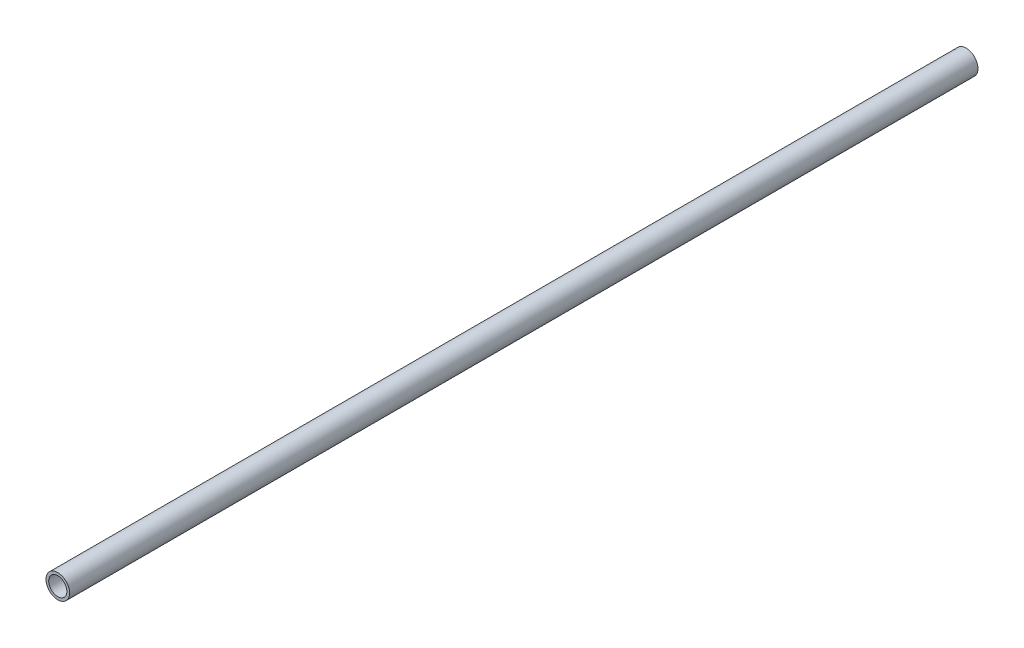
ISO-10303-21;
HEADER;
FILE_DESCRIPTION(('STEP AP214'),'2;1');
FILE_NAME('part.step','',(''),(''),'','','');
FILE_SCHEMA(('AUTOMOTIVE_DESIGN { 1 0 10303 214 1 1 1 1 }'));
ENDSEC;
DATA;
#1=APPLICATION_CONTEXT('core data for automotive mechanical design processes');
#2=APPLICATION_PROTOCOL_DEFINITION('international standard','automotive_design',2000,#1);
#3=PRODUCT_CONTEXT('',#1,'mechanical');
#4=PRODUCT('Part','Part','',(#3));
#5=PRODUCT_RELATED_PRODUCT_CATEGORY('part','',(#4));
#6=PRODUCT_DEFINITION_FORMATION('','',#4);
#7=PRODUCT_DEFINITION_CONTEXT('part definition',#1,'design');
#8=PRODUCT_DEFINITION('design','',#6,#7);
#9=PRODUCT_DEFINITION_SHAPE('','',#8);
#10=(LENGTH_UNIT() NAMED_UNIT(*) SI_UNIT(.MILLI.,.METRE.));
#11=(NAMED_UNIT(*) PLANE_ANGLE_UNIT() SI_UNIT($,.RADIAN.));
#12=(NAMED_UNIT(*) SI_UNIT($,.STERADIAN.) SOLID_ANGLE_UNIT());
#13=UNCERTAINTY_MEASURE_WITH_UNIT(LENGTH_MEASURE(1.E-05),#10,'distance_accuracy_value','');
#14=(GEOMETRIC_REPRESENTATION_CONTEXT(3) GLOBAL_UNCERTAINTY_ASSIGNED_CONTEXT((#13)) GLOBAL_UNIT_ASSIGNED_CONTEXT((#10,
#11,#12)) REPRESENTATION_CONTEXT('',''));
#15=CARTESIAN_POINT('',(0.,0.,0.));
#16=DIRECTION('',(0.,0.,1.));
#17=DIRECTION('',(1.,0.,0.));
#18=AXIS2_PLACEMENT_3D('',#15,#16,#17);
#19=CARTESIAN_POINT('',(390.761403900086,31.0815288811455,500.));
#20=DIRECTION('',(0.,0.,1.));
#21=DIRECTION('',(1.,0.,0.));
#22=AXIS2_PLACEMENT_3D('',#19,#20,#21);
#23=PLANE('',#22);
#24=CARTESIAN_POINT('',(390.761403900086,31.0815288811455,500.));
#25=DIRECTION('',(0.,0.,1.));
#26=DIRECTION('',(1.,0.,0.));
#27=AXIS2_PLACEMENT_3D('',#24,#25,#26);
#28=CIRCLE('',#27,6.50000000000002);
#29=CARTESIAN_POINT('',(397.261403900086,31.0815288811455,500.));
#30=VERTEX_POINT('',#29);
#31=EDGE_CURVE('E10',#30,#30,#28,.T.);
#32=ORIENTED_EDGE('',*,*,#31,.T.);
#33=EDGE_LOOP('',(#32));
#34=FACE_BOUND('',#33,.T.);
#35=CARTESIAN_POINT('',(390.761403900086,31.0815288811455,500.));
#36=DIRECTION('',(0.,0.,1.));
#37=DIRECTION('',(1.,0.,0.));
#38=AXIS2_PLACEMENT_3D('',#35,#36,#37);
#39=CIRCLE('',#38,4.99999999999999);
#40=CARTESIAN_POINT('',(395.761403900086,31.0815288811455,500.));
#41=VERTEX_POINT('',#40);
#42=EDGE_CURVE('E41',#41,#41,#39,.T.);
#43=ORIENTED_EDGE('',*,*,#42,.F.);
#44=EDGE_LOOP('',(#43));
#45=FACE_BOUND('',#44,.T.);
#46=ADVANCED_FACE('F30',(#34,#45),#23,.T.);
#47=CARTESIAN_POINT('',(390.761403900086,31.0815288811455,0.));
#48=DIRECTION('',(0.,0.,1.));
#49=DIRECTION('',(1.,0.,0.));
#50=AXIS2_PLACEMENT_3D('',#47,#48,#49);
#51=PLANE('',#50);
#52=CARTESIAN_POINT('',(390.761403900086,31.0815288811455,0.));
#53=DIRECTION('',(0.,0.,1.));
#54=DIRECTION('',(1.,0.,0.));
#55=AXIS2_PLACEMENT_3D('',#52,#53,#54);
#56=CIRCLE('',#55,6.50000000000002);
#57=CARTESIAN_POINT('',(397.261403900086,31.0815288811455,0.));
#58=VERTEX_POINT('',#57);
#59=EDGE_CURVE('E34',#58,#58,#56,.T.);
#60=ORIENTED_EDGE('',*,*,#59,.F.);
#61=EDGE_LOOP('',(#60));
#62=FACE_BOUND('',#61,.T.);
#63=CARTESIAN_POINT('',(390.761403900086,31.0815288811455,0.));
#64=DIRECTION('',(0.,0.,1.));
#65=DIRECTION('',(1.,0.,0.));
#66=AXIS2_PLACEMENT_3D('',#63,#64,#65);
#67=CIRCLE('',#66,4.99999999999999);
#68=CARTESIAN_POINT('',(395.761403900086,31.0815288811455,0.));
#69=VERTEX_POINT('',#68);
#70=EDGE_CURVE('E43',#69,#69,#67,.T.);
#71=ORIENTED_EDGE('',*,*,#70,.T.);
#72=EDGE_LOOP('',(#71));
#73=FACE_BOUND('',#72,.T.);
#74=ADVANCED_FACE('F53',(#62,#73),#51,.F.);
#75=CARTESIAN_POINT('',(390.761403900086,31.0815288811455,500.));
#76=DIRECTION('',(0.,0.,-1.));
#77=DIRECTION('',(-1.,0.,0.));
#78=AXIS2_PLACEMENT_3D('',#75,#76,#77);
#79=CYLINDRICAL_SURFACE('',#78,6.50000000000002);
#80=ORIENTED_EDGE('',*,*,#31,.F.);
#81=EDGE_LOOP('',(#80));
#82=FACE_BOUND('',#81,.T.);
#83=ORIENTED_EDGE('',*,*,#59,.T.);
#84=EDGE_LOOP('',(#83));
#85=FACE_BOUND('',#84,.T.);
#86=ADVANCED_FACE('F32',(#82,#85),#79,.T.);
#87=CARTESIAN_POINT('',(390.761403900086,31.0815288811455,500.));
#88=DIRECTION('',(0.,0.,-1.));
#89=DIRECTION('',(-1.,0.,0.));
#90=AXIS2_PLACEMENT_3D('',#87,#88,#89);
#91=CYLINDRICAL_SURFACE('',#90,4.99999999999999);
#92=ORIENTED_EDGE('',*,*,#42,.T.);
#93=EDGE_LOOP('',(#92));
#94=FACE_BOUND('',#93,.T.);
#95=ORIENTED_EDGE('',*,*,#70,.F.);
#96=EDGE_LOOP('',(#95));
#97=FACE_BOUND('',#96,.T.);
#98=ADVANCED_FACE('F49',(#94,#97),#91,.F.);
#99=CLOSED_SHELL('',(#46,#74,#86,#98));
#100=MANIFOLD_SOLID_BREP('B2',#99);
#101=ADVANCED_BREP_SHAPE_REPRESENTATION('',(#18,#100),#14);
#102=SHAPE_DEFINITION_REPRESENTATION(#9,#101);
ENDSEC;
END-ISO-10303-21;
